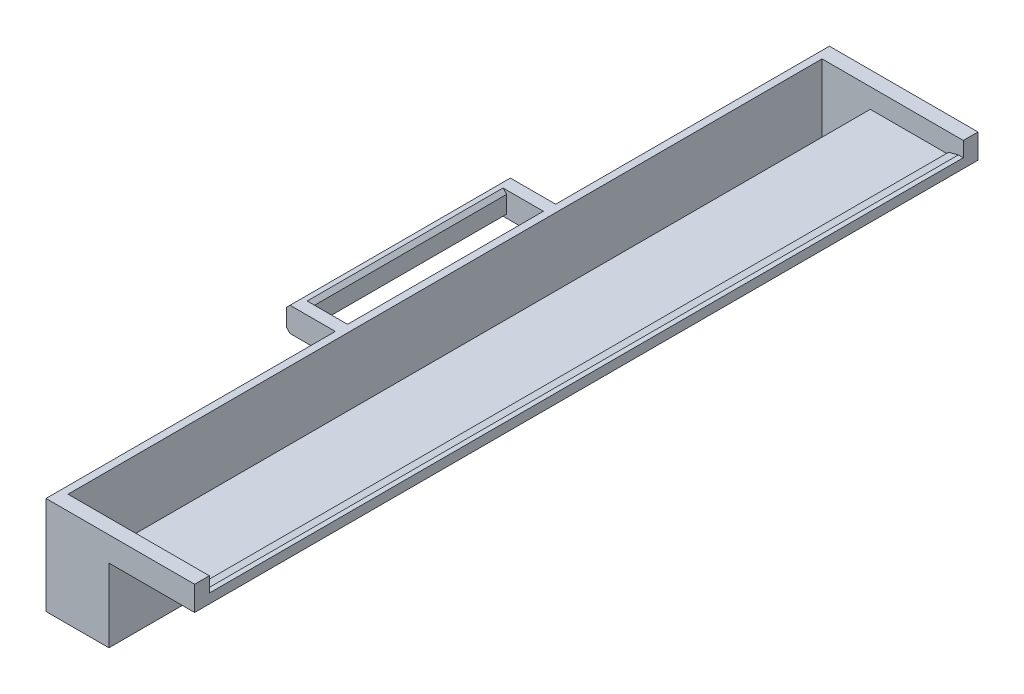
ISO-10303-21;
HEADER;
FILE_DESCRIPTION(('STEP AP214'),'2;1');
FILE_NAME('part.step','',(''),(''),'','','');
FILE_SCHEMA(('AUTOMOTIVE_DESIGN { 1 0 10303 214 1 1 1 1 }'));
ENDSEC;
DATA;
#1=APPLICATION_CONTEXT('core data for automotive mechanical design processes');
#2=APPLICATION_PROTOCOL_DEFINITION('international standard','automotive_design',2000,#1);
#3=PRODUCT_CONTEXT('',#1,'mechanical');
#4=PRODUCT('Part','Part','',(#3));
#5=PRODUCT_RELATED_PRODUCT_CATEGORY('part','',(#4));
#6=PRODUCT_DEFINITION_FORMATION('','',#4);
#7=PRODUCT_DEFINITION_CONTEXT('part definition',#1,'design');
#8=PRODUCT_DEFINITION('design','',#6,#7);
#9=PRODUCT_DEFINITION_SHAPE('','',#8);
#10=(LENGTH_UNIT() NAMED_UNIT(*) SI_UNIT(.MILLI.,.METRE.));
#11=(NAMED_UNIT(*) PLANE_ANGLE_UNIT() SI_UNIT($,.RADIAN.));
#12=(NAMED_UNIT(*) SI_UNIT($,.STERADIAN.) SOLID_ANGLE_UNIT());
#13=UNCERTAINTY_MEASURE_WITH_UNIT(LENGTH_MEASURE(1.E-05),#10,'distance_accuracy_value','');
#14=(GEOMETRIC_REPRESENTATION_CONTEXT(3) GLOBAL_UNCERTAINTY_ASSIGNED_CONTEXT((#13)) GLOBAL_UNIT_ASSIGNED_CONTEXT((#10,
#11,#12)) REPRESENTATION_CONTEXT('',''));
#15=CARTESIAN_POINT('',(0.,0.,0.));
#16=DIRECTION('',(0.,0.,1.));
#17=DIRECTION('',(1.,0.,0.));
#18=AXIS2_PLACEMENT_3D('',#15,#16,#17);
#19=CARTESIAN_POINT('',(-65.6625346479725,7.7724,406.4));
#20=DIRECTION('',(1.,0.,0.));
#21=DIRECTION('',(0.,0.,-1.));
#22=AXIS2_PLACEMENT_3D('',#19,#20,#21);
#23=PLANE('',#22);
#24=DIRECTION('',(0.,0.,-1.));
#25=VECTOR('',#24,1.);
#26=CARTESIAN_POINT('',(-65.6625346479725,-39.2176,406.4));
#27=LINE('',#26,#25);
#28=CARTESIAN_POINT('',(-65.6625346479725,-39.2176,398.78));
#29=VERTEX_POINT('',#28);
#30=CARTESIAN_POINT('',(-65.6625346479725,-39.2176,7.62000000000001));
#31=VERTEX_POINT('',#30);
#32=EDGE_CURVE('E371',#29,#31,#27,.T.);
#33=ORIENTED_EDGE('',*,*,#32,.T.);
#34=DIRECTION('',(0.,-1.,0.));
#35=VECTOR('',#34,1.);
#36=CARTESIAN_POINT('',(-65.6625346479725,7.7724,7.62000000000001));
#37=LINE('',#36,#35);
#38=CARTESIAN_POINT('',(-65.6625346479725,7.7724,7.62000000000001));
#39=VERTEX_POINT('',#38);
#40=EDGE_CURVE('E300',#39,#31,#37,.T.);
#41=ORIENTED_EDGE('',*,*,#40,.F.);
#42=DIRECTION('',(0.,0.,-1.));
#43=VECTOR('',#42,1.);
#44=CARTESIAN_POINT('',(-65.6625346479725,7.7724,406.4));
#45=LINE('',#44,#43);
#46=CARTESIAN_POINT('',(-65.6625346479725,7.7724,398.78));
#47=VERTEX_POINT('',#46);
#48=EDGE_CURVE('E374',#47,#39,#45,.T.);
#49=ORIENTED_EDGE('',*,*,#48,.F.);
#50=DIRECTION('',(0.,-1.,0.));
#51=VECTOR('',#50,1.);
#52=CARTESIAN_POINT('',(-65.6625346479725,7.7724,398.78));
#53=LINE('',#52,#51);
#54=EDGE_CURVE('E313',#47,#29,#53,.T.);
#55=ORIENTED_EDGE('',*,*,#54,.T.);
#56=EDGE_LOOP('',(#33,#41,#49,#55));
#57=FACE_BOUND('',#56,.T.);
#58=ADVANCED_FACE('F40',(#57),#23,.T.);
#59=CARTESIAN_POINT('',(-40.64,-39.2176,406.4));
#60=DIRECTION('',(-1.,0.,0.));
#61=DIRECTION('',(0.,0.,1.));
#62=AXIS2_PLACEMENT_3D('',#59,#60,#61);
#63=PLANE('',#62);
#64=DIRECTION('',(0.,-1.,0.));
#65=VECTOR('',#64,1.);
#66=CARTESIAN_POINT('',(-40.64,-39.2176,7.62000000000001));
#67=LINE('',#66,#65);
#68=CARTESIAN_POINT('',(-40.64,-2.3876,7.62000000000002));
#69=VERTEX_POINT('',#68);
#70=CARTESIAN_POINT('',(-40.64,-39.2176,7.62000000000001));
#71=VERTEX_POINT('',#70);
#72=EDGE_CURVE('E264',#69,#71,#67,.T.);
#73=ORIENTED_EDGE('',*,*,#72,.T.);
#74=DIRECTION('',(0.,0.,-1.));
#75=VECTOR('',#74,1.);
#76=CARTESIAN_POINT('',(-40.64,-39.2176,406.4));
#77=LINE('',#76,#75);
#78=CARTESIAN_POINT('',(-40.64,-39.2176,398.78));
#79=VERTEX_POINT('',#78);
#80=EDGE_CURVE('E368',#79,#71,#77,.T.);
#81=ORIENTED_EDGE('',*,*,#80,.F.);
#82=DIRECTION('',(0.,1.,0.));
#83=VECTOR('',#82,1.);
#84=CARTESIAN_POINT('',(-40.64,-39.2176,398.78));
#85=LINE('',#84,#83);
#86=CARTESIAN_POINT('',(-40.64,-2.3876,398.78));
#87=VERTEX_POINT('',#86);
#88=EDGE_CURVE('E288',#79,#87,#85,.T.);
#89=ORIENTED_EDGE('',*,*,#88,.T.);
#90=DIRECTION('',(0.,0.,-1.));
#91=VECTOR('',#90,1.);
#92=CARTESIAN_POINT('',(-40.64,-2.3876,406.4));
#93=LINE('',#92,#91);
#94=EDGE_CURVE('E365',#87,#69,#93,.T.);
#95=ORIENTED_EDGE('',*,*,#94,.T.);
#96=EDGE_LOOP('',(#73,#81,#89,#95));
#97=FACE_BOUND('',#96,.T.);
#98=ADVANCED_FACE('F433',(#97),#63,.T.);
#99=CARTESIAN_POINT('',(-65.6625346479725,-39.2176,406.4));
#100=DIRECTION('',(0.,1.,0.));
#101=DIRECTION('',(0.,0.,1.));
#102=AXIS2_PLACEMENT_3D('',#99,#100,#101);
#103=PLANE('',#102);
#104=DIRECTION('',(-1.,0.,0.));
#105=VECTOR('',#104,1.);
#106=CARTESIAN_POINT('',(-65.6625346479725,-39.2176,7.62000000000001));
#107=LINE('',#106,#105);
#108=EDGE_CURVE('E282',#71,#31,#107,.T.);
#109=ORIENTED_EDGE('',*,*,#108,.T.);
#110=ORIENTED_EDGE('',*,*,#32,.F.);
#111=DIRECTION('',(1.,0.,0.));
#112=VECTOR('',#111,1.);
#113=CARTESIAN_POINT('',(-65.6625346479725,-39.2176,398.78));
#114=LINE('',#113,#112);
#115=EDGE_CURVE('E285',#29,#79,#114,.T.);
#116=ORIENTED_EDGE('',*,*,#115,.T.);
#117=ORIENTED_EDGE('',*,*,#80,.T.);
#118=EDGE_LOOP('',(#109,#110,#116,#117));
#119=FACE_BOUND('',#118,.T.);
#120=ADVANCED_FACE('F441',(#119),#103,.T.);
#121=CARTESIAN_POINT('',(7.62,0.,406.4));
#122=DIRECTION('',(0.,-1.,0.));
#123=DIRECTION('',(1.,0.,0.));
#124=AXIS2_PLACEMENT_3D('',#121,#122,#123);
#125=PLANE('',#124);
#126=DIRECTION('',(1.,0.,0.));
#127=VECTOR('',#126,1.);
#128=CARTESIAN_POINT('',(7.61999999999994,0.,7.62000000000002));
#129=LINE('',#128,#127);
#130=CARTESIAN_POINT('',(5.07999999999997,0.,7.62000000000002));
#131=VERTEX_POINT('',#130);
#132=CARTESIAN_POINT('',(7.62,0.,7.62000000000002));
#133=VERTEX_POINT('',#132);
#134=EDGE_CURVE('E304',#131,#133,#129,.T.);
#135=ORIENTED_EDGE('',*,*,#134,.F.);
#136=DIRECTION('',(0.,0.,1.));
#137=VECTOR('',#136,1.);
#138=CARTESIAN_POINT('',(5.07999999999997,0.,406.4));
#139=LINE('',#138,#137);
#140=CARTESIAN_POINT('',(5.07999999999997,0.,398.78));
#141=VERTEX_POINT('',#140);
#142=EDGE_CURVE('E55',#131,#141,#139,.T.);
#143=ORIENTED_EDGE('',*,*,#142,.T.);
#144=DIRECTION('',(-1.,0.,0.));
#145=VECTOR('',#144,1.);
#146=CARTESIAN_POINT('',(7.62,0.,398.78));
#147=LINE('',#146,#145);
#148=CARTESIAN_POINT('',(7.62,0.,398.78));
#149=VERTEX_POINT('',#148);
#150=EDGE_CURVE('E322',#149,#141,#147,.T.);
#151=ORIENTED_EDGE('',*,*,#150,.F.);
#152=DIRECTION('',(0.,0.,-1.));
#153=VECTOR('',#152,1.);
#154=CARTESIAN_POINT('',(7.62,0.,406.4));
#155=LINE('',#154,#153);
#156=EDGE_CURVE('E359',#149,#133,#155,.T.);
#157=ORIENTED_EDGE('',*,*,#156,.T.);
#158=EDGE_LOOP('',(#135,#143,#151,#157));
#159=FACE_BOUND('',#158,.T.);
#160=ADVANCED_FACE('F453',(#159),#125,.F.);
#161=CARTESIAN_POINT('',(0.,0.,406.4));
#162=DIRECTION('',(1.,0.,0.));
#163=DIRECTION('',(0.,1.,0.));
#164=AXIS2_PLACEMENT_3D('',#161,#162,#163);
#165=PLANE('',#164);
#166=DIRECTION('',(0.,-1.,0.));
#167=VECTOR('',#166,1.);
#168=CARTESIAN_POINT('',(0.,0.,398.78));
#169=LINE('',#168,#167);
#170=CARTESIAN_POINT('',(0.,-1.36118189755008,398.78));
#171=VERTEX_POINT('',#170);
#172=CARTESIAN_POINT('',(0.,-2.3876,398.78));
#173=VERTEX_POINT('',#172);
#174=EDGE_CURVE('E320',#171,#173,#169,.T.);
#175=ORIENTED_EDGE('',*,*,#174,.F.);
#176=DIRECTION('',(0.,0.,-1.));
#177=VECTOR('',#176,1.);
#178=CARTESIAN_POINT('',(0.,-1.36118189755008,406.4));
#179=LINE('',#178,#177);
#180=CARTESIAN_POINT('',(0.,-1.36118189755008,7.62000000000002));
#181=VERTEX_POINT('',#180);
#182=EDGE_CURVE('E416',#171,#181,#179,.T.);
#183=ORIENTED_EDGE('',*,*,#182,.T.);
#184=DIRECTION('',(0.,1.,0.));
#185=VECTOR('',#184,1.);
#186=CARTESIAN_POINT('',(0.,0.,7.62000000000002));
#187=LINE('',#186,#185);
#188=CARTESIAN_POINT('',(0.,-2.3876,7.62000000000002));
#189=VERTEX_POINT('',#188);
#190=EDGE_CURVE('E302',#189,#181,#187,.T.);
#191=ORIENTED_EDGE('',*,*,#190,.F.);
#192=DIRECTION('',(0.,0.,-1.));
#193=VECTOR('',#192,1.);
#194=CARTESIAN_POINT('',(0.,-2.3876,406.4));
#195=LINE('',#194,#193);
#196=EDGE_CURVE('E362',#173,#189,#195,.T.);
#197=ORIENTED_EDGE('',*,*,#196,.F.);
#198=EDGE_LOOP('',(#175,#183,#191,#197));
#199=FACE_BOUND('',#198,.T.);
#200=ADVANCED_FACE('F422',(#199),#165,.F.);
#201=CARTESIAN_POINT('',(0.,-2.3876,406.4));
#202=DIRECTION('',(0.,-1.,0.));
#203=DIRECTION('',(1.,0.,0.));
#204=AXIS2_PLACEMENT_3D('',#201,#202,#203);
#205=PLANE('',#204);
#206=DIRECTION('',(1.,0.,0.));
#207=VECTOR('',#206,1.);
#208=CARTESIAN_POINT('',(7.62,-2.3876,7.62));
#209=LINE('',#208,#207);
#210=EDGE_CURVE('E290',#69,#189,#209,.T.);
#211=ORIENTED_EDGE('',*,*,#210,.F.);
#212=ORIENTED_EDGE('',*,*,#94,.F.);
#213=DIRECTION('',(-1.,0.,0.));
#214=VECTOR('',#213,1.);
#215=CARTESIAN_POINT('',(7.62,-2.3876,398.78));
#216=LINE('',#215,#214);
#217=EDGE_CURVE('E306',#173,#87,#216,.T.);
#218=ORIENTED_EDGE('',*,*,#217,.F.);
#219=ORIENTED_EDGE('',*,*,#196,.T.);
#220=EDGE_LOOP('',(#211,#212,#218,#219));
#221=FACE_BOUND('',#220,.T.);
#222=ADVANCED_FACE('F430',(#221),#205,.F.);
#223=CARTESIAN_POINT('',(-36.83,-4.9276,406.4));
#224=DIRECTION('',(1.,0.,0.));
#225=DIRECTION('',(0.,1.,0.));
#226=AXIS2_PLACEMENT_3D('',#223,#224,#225);
#227=PLANE('',#226);
#228=DIRECTION('',(0.,-1.,0.));
#229=VECTOR('',#228,1.);
#230=CARTESIAN_POINT('',(-36.83,-4.9276,0.));
#231=LINE('',#230,#229);
#232=CARTESIAN_POINT('',(-36.83,-4.9276,0.));
#233=VERTEX_POINT('',#232);
#234=CARTESIAN_POINT('',(-36.83,-43.0276,0.));
#235=VERTEX_POINT('',#234);
#236=EDGE_CURVE('E324',#233,#235,#231,.T.);
#237=ORIENTED_EDGE('',*,*,#236,.F.);
#238=DIRECTION('',(0.,0.,-1.));
#239=VECTOR('',#238,1.);
#240=CARTESIAN_POINT('',(-36.83,-4.9276,406.4));
#241=LINE('',#240,#239);
#242=CARTESIAN_POINT('',(-36.83,-4.9276,406.4));
#243=VERTEX_POINT('',#242);
#244=EDGE_CURVE('E353',#243,#233,#241,.T.);
#245=ORIENTED_EDGE('',*,*,#244,.F.);
#246=DIRECTION('',(0.,-1.,0.));
#247=VECTOR('',#246,1.);
#248=CARTESIAN_POINT('',(-36.83,-4.9276,406.4));
#249=LINE('',#248,#247);
#250=CARTESIAN_POINT('',(-36.83,-43.0276,406.4));
#251=VERTEX_POINT('',#250);
#252=EDGE_CURVE('E325',#243,#251,#249,.T.);
#253=ORIENTED_EDGE('',*,*,#252,.T.);
#254=DIRECTION('',(0.,0.,-1.));
#255=VECTOR('',#254,1.);
#256=CARTESIAN_POINT('',(-36.83,-43.0276,406.4));
#257=LINE('',#256,#255);
#258=EDGE_CURVE('E341',#251,#235,#257,.T.);
#259=ORIENTED_EDGE('',*,*,#258,.T.);
#260=EDGE_LOOP('',(#237,#245,#253,#259));
#261=FACE_BOUND('',#260,.T.);
#262=ADVANCED_FACE('F478',(#261),#227,.T.);
#263=CARTESIAN_POINT('',(-36.83,-4.9276,406.4));
#264=DIRECTION('',(0.,1.,0.));
#265=DIRECTION('',(0.,0.,1.));
#266=AXIS2_PLACEMENT_3D('',#263,#264,#265);
#267=PLANE('',#266);
#268=DIRECTION('',(1.,0.,0.));
#269=VECTOR('',#268,1.);
#270=CARTESIAN_POINT('',(-36.83,-4.9276,0.));
#271=LINE('',#270,#269);
#272=CARTESIAN_POINT('',(7.62,-4.9276,0.));
#273=VERTEX_POINT('',#272);
#274=EDGE_CURVE('E329',#233,#273,#271,.T.);
#275=ORIENTED_EDGE('',*,*,#274,.T.);
#276=DIRECTION('',(0.,0.,-1.));
#277=VECTOR('',#276,1.);
#278=CARTESIAN_POINT('',(7.62,-4.9276,406.4));
#279=LINE('',#278,#277);
#280=CARTESIAN_POINT('',(7.62,-4.9276,406.4));
#281=VERTEX_POINT('',#280);
#282=EDGE_CURVE('E356',#281,#273,#279,.T.);
#283=ORIENTED_EDGE('',*,*,#282,.F.);
#284=DIRECTION('',(1.,0.,0.));
#285=VECTOR('',#284,1.);
#286=CARTESIAN_POINT('',(-36.83,-4.9276,406.4));
#287=LINE('',#286,#285);
#288=EDGE_CURVE('E339',#243,#281,#287,.T.);
#289=ORIENTED_EDGE('',*,*,#288,.F.);
#290=ORIENTED_EDGE('',*,*,#244,.T.);
#291=EDGE_LOOP('',(#275,#283,#289,#290));
#292=FACE_BOUND('',#291,.T.);
#293=ADVANCED_FACE('F481',(#292),#267,.F.);
#294=CARTESIAN_POINT('',(7.62,-4.9276,406.4));
#295=DIRECTION('',(-1.,0.,0.));
#296=DIRECTION('',(0.,0.,1.));
#297=AXIS2_PLACEMENT_3D('',#294,#295,#296);
#298=PLANE('',#297);
#299=DIRECTION('',(0.,1.,0.));
#300=VECTOR('',#299,1.);
#301=CARTESIAN_POINT('',(7.62,-4.9276,0.));
#302=LINE('',#301,#300);
#303=CARTESIAN_POINT('',(7.62,7.77240000000001,0.));
#304=VERTEX_POINT('',#303);
#305=EDGE_CURVE('E350',#273,#304,#302,.T.);
#306=ORIENTED_EDGE('',*,*,#305,.T.);
#307=DIRECTION('',(0.,0.,-1.));
#308=VECTOR('',#307,1.);
#309=CARTESIAN_POINT('',(7.62,7.77240000000001,0.));
#310=LINE('',#309,#308);
#311=CARTESIAN_POINT('',(7.62,7.77240000000001,7.62));
#312=VERTEX_POINT('',#311);
#313=EDGE_CURVE('E291',#312,#304,#310,.T.);
#314=ORIENTED_EDGE('',*,*,#313,.F.);
#315=DIRECTION('',(0.,-1.,0.));
#316=VECTOR('',#315,1.);
#317=CARTESIAN_POINT('',(7.62,7.77240000000001,7.62));
#318=LINE('',#317,#316);
#319=EDGE_CURVE('E295',#312,#133,#318,.T.);
#320=ORIENTED_EDGE('',*,*,#319,.T.);
#321=ORIENTED_EDGE('',*,*,#156,.F.);
#322=DIRECTION('',(0.,-1.,0.));
#323=VECTOR('',#322,1.);
#324=CARTESIAN_POINT('',(7.62,7.77240000000001,398.78));
#325=LINE('',#324,#323);
#326=CARTESIAN_POINT('',(7.62,7.77240000000001,398.78));
#327=VERTEX_POINT('',#326);
#328=EDGE_CURVE('E317',#327,#149,#325,.T.);
#329=ORIENTED_EDGE('',*,*,#328,.F.);
#330=DIRECTION('',(0.,0.,-1.));
#331=VECTOR('',#330,1.);
#332=CARTESIAN_POINT('',(7.62,7.77240000000001,406.4));
#333=LINE('',#332,#331);
#334=CARTESIAN_POINT('',(7.62,7.77240000000001,406.4));
#335=VERTEX_POINT('',#334);
#336=EDGE_CURVE('E307',#335,#327,#333,.T.);
#337=ORIENTED_EDGE('',*,*,#336,.F.);
#338=DIRECTION('',(0.,1.,0.));
#339=VECTOR('',#338,1.);
#340=CARTESIAN_POINT('',(7.62,-4.9276,406.4));
#341=LINE('',#340,#339);
#342=EDGE_CURVE('E337',#281,#335,#341,.T.);
#343=ORIENTED_EDGE('',*,*,#342,.F.);
#344=ORIENTED_EDGE('',*,*,#282,.T.);
#345=EDGE_LOOP('',(#306,#314,#320,#321,#329,#337,#343,#344));
#346=FACE_BOUND('',#345,.T.);
#347=ADVANCED_FACE('F450',(#346),#298,.F.);
#348=CARTESIAN_POINT('',(-69.4725346479725,7.7724,406.4));
#349=DIRECTION('',(0.,1.,0.));
#350=DIRECTION('',(0.,0.,1.));
#351=AXIS2_PLACEMENT_3D('',#348,#349,#350);
#352=PLANE('',#351);
#353=DIRECTION('',(0.,0.,-1.));
#354=VECTOR('',#353,1.);
#355=CARTESIAN_POINT('',(-90.4275346479724,7.7724,406.4));
#356=LINE('',#355,#354);
#357=CARTESIAN_POINT('',(-90.4275346479725,7.7724,249.958132937121));
#358=VERTEX_POINT('',#357);
#359=CARTESIAN_POINT('',(-90.4275346479725,7.7724,148.358132937121));
#360=VERTEX_POINT('',#359);
#361=EDGE_CURVE('E401',#358,#360,#356,.T.);
#362=ORIENTED_EDGE('',*,*,#361,.T.);
#363=DIRECTION('',(1.,0.,0.));
#364=VECTOR('',#363,1.);
#365=CARTESIAN_POINT('',(-69.4725346479725,7.7724,148.358132937121));
#366=LINE('',#365,#364);
#367=CARTESIAN_POINT('',(-69.4725346479725,7.7724,148.358132937121));
#368=VERTEX_POINT('',#367);
#369=EDGE_CURVE('E258',#360,#368,#366,.T.);
#370=ORIENTED_EDGE('',*,*,#369,.T.);
#371=DIRECTION('',(0.,0.,-1.));
#372=VECTOR('',#371,1.);
#373=CARTESIAN_POINT('',(-69.4725346479725,7.7724,406.4));
#374=LINE('',#373,#372);
#375=CARTESIAN_POINT('',(-69.4725346479725,7.7724,249.958132937121));
#376=VERTEX_POINT('',#375);
#377=EDGE_CURVE('E230',#376,#368,#374,.T.);
#378=ORIENTED_EDGE('',*,*,#377,.F.);
#379=DIRECTION('',(-1.,0.,0.));
#380=VECTOR('',#379,1.);
#381=CARTESIAN_POINT('',(-88.5225346479724,7.7724,249.958132937121));
#382=LINE('',#381,#380);
#383=EDGE_CURVE('E252',#376,#358,#382,.T.);
#384=ORIENTED_EDGE('',*,*,#383,.T.);
#385=EDGE_LOOP('',(#362,#370,#378,#384));
#386=FACE_BOUND('',#385,.T.);
#387=DIRECTION('',(-1.,0.,0.));
#388=VECTOR('',#387,1.);
#389=CARTESIAN_POINT('',(-69.4725346479725,7.7724,142.008132937121));
#390=LINE('',#389,#388);
#391=CARTESIAN_POINT('',(-69.4725346479725,7.7724,142.008132937121));
#392=VERTEX_POINT('',#391);
#393=CARTESIAN_POINT('',(-92.9675346479725,7.7724,142.008132937121));
#394=VERTEX_POINT('',#393);
#395=EDGE_CURVE('E222',#392,#394,#390,.T.);
#396=ORIENTED_EDGE('',*,*,#395,.T.);
#397=DIRECTION('',(0.,0.,1.));
#398=VECTOR('',#397,1.);
#399=CARTESIAN_POINT('',(-92.9675346479724,7.7724,406.4));
#400=LINE('',#399,#398);
#401=CARTESIAN_POINT('',(-92.9675346479725,7.7724,256.30813293712));
#402=VERTEX_POINT('',#401);
#403=EDGE_CURVE('E404',#394,#402,#400,.T.);
#404=ORIENTED_EDGE('',*,*,#403,.T.);
#405=DIRECTION('',(1.,0.,0.));
#406=VECTOR('',#405,1.);
#407=CARTESIAN_POINT('',(-69.4725346479725,7.7724,256.30813293712));
#408=LINE('',#407,#406);
#409=CARTESIAN_POINT('',(-69.4725346479725,7.7724,256.30813293712));
#410=VERTEX_POINT('',#409);
#411=EDGE_CURVE('E250',#402,#410,#408,.T.);
#412=ORIENTED_EDGE('',*,*,#411,.T.);
#413=CARTESIAN_POINT('',(-69.4725346479725,7.7724,406.4));
#414=VERTEX_POINT('',#413);
#415=EDGE_CURVE('E233',#414,#410,#374,.T.);
#416=ORIENTED_EDGE('',*,*,#415,.F.);
#417=DIRECTION('',(1.,0.,0.));
#418=VECTOR('',#417,1.);
#419=CARTESIAN_POINT('',(-69.4725346479725,7.7724,406.4));
#420=LINE('',#419,#418);
#421=EDGE_CURVE('E334',#414,#335,#420,.T.);
#422=ORIENTED_EDGE('',*,*,#421,.T.);
#423=ORIENTED_EDGE('',*,*,#336,.T.);
#424=DIRECTION('',(-1.,0.,0.));
#425=VECTOR('',#424,1.);
#426=CARTESIAN_POINT('',(7.62,7.77240000000001,398.78));
#427=LINE('',#426,#425);
#428=EDGE_CURVE('E310',#327,#47,#427,.T.);
#429=ORIENTED_EDGE('',*,*,#428,.T.);
#430=ORIENTED_EDGE('',*,*,#48,.T.);
#431=DIRECTION('',(1.,0.,0.));
#432=VECTOR('',#431,1.);
#433=CARTESIAN_POINT('',(7.62,7.77240000000001,7.62));
#434=LINE('',#433,#432);
#435=EDGE_CURVE('E293',#39,#312,#434,.T.);
#436=ORIENTED_EDGE('',*,*,#435,.T.);
#437=ORIENTED_EDGE('',*,*,#313,.T.);
#438=DIRECTION('',(1.,0.,0.));
#439=VECTOR('',#438,1.);
#440=CARTESIAN_POINT('',(-69.4725346479725,7.7724,0.));
#441=LINE('',#440,#439);
#442=CARTESIAN_POINT('',(-69.4725346479725,7.7724,0.));
#443=VERTEX_POINT('',#442);
#444=EDGE_CURVE('E226',#443,#304,#441,.T.);
#445=ORIENTED_EDGE('',*,*,#444,.F.);
#446=EDGE_CURVE('E217',#392,#443,#374,.T.);
#447=ORIENTED_EDGE('',*,*,#446,.F.);
#448=EDGE_LOOP('',(#396,#404,#412,#416,#422,#423,#429,#430,#436,#437,#445,#447));
#449=FACE_BOUND('',#448,.T.);
#450=ADVANCED_FACE('F219',(#386,#449),#352,.T.);
#451=CARTESIAN_POINT('',(-69.4725346479725,-43.0276,406.4));
#452=DIRECTION('',(-1.,0.,0.));
#453=DIRECTION('',(0.,0.,1.));
#454=AXIS2_PLACEMENT_3D('',#451,#452,#453);
#455=PLANE('',#454);
#456=DIRECTION('',(0.,1.,0.));
#457=VECTOR('',#456,1.);
#458=CARTESIAN_POINT('',(-69.4725346479725,-4.9276,249.958132937121));
#459=LINE('',#458,#457);
#460=CARTESIAN_POINT('',(-69.4725346479725,-4.9276,249.958132937121));
#461=VERTEX_POINT('',#460);
#462=EDGE_CURVE('E271',#461,#376,#459,.T.);
#463=ORIENTED_EDGE('',*,*,#462,.T.);
#464=ORIENTED_EDGE('',*,*,#377,.T.);
#465=DIRECTION('',(0.,1.,0.));
#466=VECTOR('',#465,1.);
#467=CARTESIAN_POINT('',(-69.4725346479725,-4.9276,148.358132937121));
#468=LINE('',#467,#466);
#469=CARTESIAN_POINT('',(-69.4725346479725,-4.9276,148.358132937121));
#470=VERTEX_POINT('',#469);
#471=EDGE_CURVE('E261',#470,#368,#468,.T.);
#472=ORIENTED_EDGE('',*,*,#471,.F.);
#473=DIRECTION('',(0.,0.,-1.));
#474=VECTOR('',#473,1.);
#475=CARTESIAN_POINT('',(-69.4725346479725,-4.9276,148.358132937121));
#476=LINE('',#475,#474);
#477=CARTESIAN_POINT('',(-69.4725346479725,-4.9276,142.008132937121));
#478=VERTEX_POINT('',#477);
#479=EDGE_CURVE('E239',#470,#478,#476,.T.);
#480=ORIENTED_EDGE('',*,*,#479,.T.);
#481=DIRECTION('',(0.,1.,0.));
#482=VECTOR('',#481,1.);
#483=CARTESIAN_POINT('',(-69.4725346479725,-4.9276,142.008132937121));
#484=LINE('',#483,#482);
#485=EDGE_CURVE('E235',#478,#392,#484,.T.);
#486=ORIENTED_EDGE('',*,*,#485,.T.);
#487=ORIENTED_EDGE('',*,*,#446,.T.);
#488=DIRECTION('',(0.,1.,0.));
#489=VECTOR('',#488,1.);
#490=CARTESIAN_POINT('',(-69.4725346479725,-43.0276,0.));
#491=LINE('',#490,#489);
#492=CARTESIAN_POINT('',(-69.4725346479725,-43.0276,0.));
#493=VERTEX_POINT('',#492);
#494=EDGE_CURVE('E347',#493,#443,#491,.T.);
#495=ORIENTED_EDGE('',*,*,#494,.F.);
#496=DIRECTION('',(0.,0.,-1.));
#497=VECTOR('',#496,1.);
#498=CARTESIAN_POINT('',(-69.4725346479725,-43.0276,406.4));
#499=LINE('',#498,#497);
#500=CARTESIAN_POINT('',(-69.4725346479725,-43.0276,406.4));
#501=VERTEX_POINT('',#500);
#502=EDGE_CURVE('E231',#501,#493,#499,.T.);
#503=ORIENTED_EDGE('',*,*,#502,.F.);
#504=DIRECTION('',(0.,1.,0.));
#505=VECTOR('',#504,1.);
#506=CARTESIAN_POINT('',(-69.4725346479725,-43.0276,406.4));
#507=LINE('',#506,#505);
#508=EDGE_CURVE('E331',#501,#414,#507,.T.);
#509=ORIENTED_EDGE('',*,*,#508,.T.);
#510=ORIENTED_EDGE('',*,*,#415,.T.);
#511=DIRECTION('',(0.,1.,0.));
#512=VECTOR('',#511,1.);
#513=CARTESIAN_POINT('',(-69.4725346479725,-4.9276,256.30813293712));
#514=LINE('',#513,#512);
#515=CARTESIAN_POINT('',(-69.4725346479725,-4.9276,256.30813293712));
#516=VERTEX_POINT('',#515);
#517=EDGE_CURVE('E273',#516,#410,#514,.T.);
#518=ORIENTED_EDGE('',*,*,#517,.F.);
#519=DIRECTION('',(0.,0.,-1.));
#520=VECTOR('',#519,1.);
#521=CARTESIAN_POINT('',(-69.4725346479725,-4.9276,256.30813293712));
#522=LINE('',#521,#520);
#523=EDGE_CURVE('E505',#516,#461,#522,.T.);
#524=ORIENTED_EDGE('',*,*,#523,.T.);
#525=EDGE_LOOP('',(#463,#464,#472,#480,#486,#487,#495,#503,#509,#510,#518,#524));
#526=FACE_BOUND('',#525,.T.);
#527=ADVANCED_FACE('F237',(#526),#455,.T.);
#528=CARTESIAN_POINT('',(-69.4725346479725,-43.0276,406.4));
#529=DIRECTION('',(0.,1.,0.));
#530=DIRECTION('',(0.,0.,1.));
#531=AXIS2_PLACEMENT_3D('',#528,#529,#530);
#532=PLANE('',#531);
#533=DIRECTION('',(1.,0.,0.));
#534=VECTOR('',#533,1.);
#535=CARTESIAN_POINT('',(-69.4725346479725,-43.0276,0.));
#536=LINE('',#535,#534);
#537=EDGE_CURVE('E344',#493,#235,#536,.T.);
#538=ORIENTED_EDGE('',*,*,#537,.T.);
#539=ORIENTED_EDGE('',*,*,#258,.F.);
#540=DIRECTION('',(1.,0.,0.));
#541=VECTOR('',#540,1.);
#542=CARTESIAN_POINT('',(-69.4725346479725,-43.0276,406.4));
#543=LINE('',#542,#541);
#544=EDGE_CURVE('E328',#501,#251,#543,.T.);
#545=ORIENTED_EDGE('',*,*,#544,.F.);
#546=ORIENTED_EDGE('',*,*,#502,.T.);
#547=EDGE_LOOP('',(#538,#539,#545,#546));
#548=FACE_BOUND('',#547,.T.);
#549=ADVANCED_FACE('F473',(#548),#532,.F.);
#550=CARTESIAN_POINT('',(0.,0.,406.4));
#551=DIRECTION('',(0.,0.,1.));
#552=DIRECTION('',(1.,0.,0.));
#553=AXIS2_PLACEMENT_3D('',#550,#551,#552);
#554=PLANE('',#553);
#555=ORIENTED_EDGE('',*,*,#342,.T.);
#556=ORIENTED_EDGE('',*,*,#421,.F.);
#557=ORIENTED_EDGE('',*,*,#508,.F.);
#558=ORIENTED_EDGE('',*,*,#544,.T.);
#559=ORIENTED_EDGE('',*,*,#252,.F.);
#560=ORIENTED_EDGE('',*,*,#288,.T.);
#561=EDGE_LOOP('',(#555,#556,#557,#558,#559,#560));
#562=FACE_BOUND('',#561,.T.);
#563=ADVANCED_FACE('F476',(#562),#554,.T.);
#564=CARTESIAN_POINT('',(0.,0.,0.));
#565=DIRECTION('',(0.,0.,1.));
#566=DIRECTION('',(1.,0.,0.));
#567=AXIS2_PLACEMENT_3D('',#564,#565,#566);
#568=PLANE('',#567);
#569=ORIENTED_EDGE('',*,*,#444,.T.);
#570=ORIENTED_EDGE('',*,*,#305,.F.);
#571=ORIENTED_EDGE('',*,*,#274,.F.);
#572=ORIENTED_EDGE('',*,*,#236,.T.);
#573=ORIENTED_EDGE('',*,*,#537,.F.);
#574=ORIENTED_EDGE('',*,*,#494,.T.);
#575=EDGE_LOOP('',(#569,#570,#571,#572,#573,#574));
#576=FACE_BOUND('',#575,.T.);
#577=ADVANCED_FACE('F537',(#576),#568,.F.);
#578=CARTESIAN_POINT('',(7.62,7.77240000000001,398.78));
#579=DIRECTION('',(0.,0.,1.));
#580=DIRECTION('',(1.,0.,0.));
#581=AXIS2_PLACEMENT_3D('',#578,#579,#580);
#582=PLANE('',#581);
#583=ORIENTED_EDGE('',*,*,#328,.T.);
#584=ORIENTED_EDGE('',*,*,#150,.T.);
#585=DIRECTION('',(0.965925826289069,0.258819045102518,0.));
#586=VECTOR('',#585,1.);
#587=CARTESIAN_POINT('',(9.39295226280622,1.1556520758129,398.78));
#588=LINE('',#587,#586);
#589=EDGE_CURVE('E11',#141,#171,#588,.F.);
#590=ORIENTED_EDGE('',*,*,#589,.T.);
#591=ORIENTED_EDGE('',*,*,#174,.T.);
#592=ORIENTED_EDGE('',*,*,#217,.T.);
#593=ORIENTED_EDGE('',*,*,#88,.F.);
#594=ORIENTED_EDGE('',*,*,#115,.F.);
#595=ORIENTED_EDGE('',*,*,#54,.F.);
#596=ORIENTED_EDGE('',*,*,#428,.F.);
#597=EDGE_LOOP('',(#583,#584,#590,#591,#592,#593,#594,#595,#596));
#598=FACE_BOUND('',#597,.T.);
#599=ADVANCED_FACE('F437',(#598),#582,.F.);
#600=CARTESIAN_POINT('',(7.62,7.77240000000001,7.62));
#601=DIRECTION('',(0.,0.,-1.));
#602=DIRECTION('',(-1.,0.,0.));
#603=AXIS2_PLACEMENT_3D('',#600,#601,#602);
#604=PLANE('',#603);
#605=ORIENTED_EDGE('',*,*,#190,.T.);
#606=DIRECTION('',(-0.965925826289069,-0.258819045102518,0.));
#607=VECTOR('',#606,1.);
#608=CARTESIAN_POINT('',(9.39295226280622,1.1556520758129,7.62));
#609=LINE('',#608,#607);
#610=EDGE_CURVE('E48',#181,#131,#609,.F.);
#611=ORIENTED_EDGE('',*,*,#610,.T.);
#612=ORIENTED_EDGE('',*,*,#134,.T.);
#613=ORIENTED_EDGE('',*,*,#319,.F.);
#614=ORIENTED_EDGE('',*,*,#435,.F.);
#615=ORIENTED_EDGE('',*,*,#40,.T.);
#616=ORIENTED_EDGE('',*,*,#108,.F.);
#617=ORIENTED_EDGE('',*,*,#72,.F.);
#618=ORIENTED_EDGE('',*,*,#210,.T.);
#619=EDGE_LOOP('',(#605,#611,#612,#613,#614,#615,#616,#617,#618));
#620=FACE_BOUND('',#619,.T.);
#621=ADVANCED_FACE('F426',(#620),#604,.F.);
#622=CARTESIAN_POINT('',(-69.4725346479725,-4.9276,148.358132937121));
#623=DIRECTION('',(0.,0.,1.));
#624=DIRECTION('',(1.,0.,0.));
#625=AXIS2_PLACEMENT_3D('',#622,#623,#624);
#626=PLANE('',#625);
#627=ORIENTED_EDGE('',*,*,#369,.F.);
#628=DIRECTION('',(-0.707106781186549,0.707106781186546,0.));
#629=VECTOR('',#628,1.);
#630=CARTESIAN_POINT('',(-90.4275346479725,7.77239999999998,148.358132937121));
#631=LINE('',#630,#629);
#632=CARTESIAN_POINT('',(-88.5225346479725,5.86740000000001,148.358132937121));
#633=VERTEX_POINT('',#632);
#634=EDGE_CURVE('E411',#360,#633,#631,.F.);
#635=ORIENTED_EDGE('',*,*,#634,.T.);
#636=DIRECTION('',(0.,1.,0.));
#637=VECTOR('',#636,1.);
#638=CARTESIAN_POINT('',(-88.5225346479725,-4.9276,148.358132937121));
#639=LINE('',#638,#637);
#640=CARTESIAN_POINT('',(-88.5225346479725,-3.0225999999999,148.358132937121));
#641=VERTEX_POINT('',#640);
#642=EDGE_CURVE('E265',#641,#633,#639,.T.);
#643=ORIENTED_EDGE('',*,*,#642,.F.);
#644=DIRECTION('',(-0.707106781186536,-0.707106781186559,0.));
#645=VECTOR('',#644,1.);
#646=CARTESIAN_POINT('',(-88.5225346479725,-3.0225999999999,148.358132937121));
#647=LINE('',#646,#645);
#648=CARTESIAN_POINT('',(-90.4275346479725,-4.9276,148.358132937121));
#649=VERTEX_POINT('',#648);
#650=EDGE_CURVE('E406',#641,#649,#647,.T.);
#651=ORIENTED_EDGE('',*,*,#650,.T.);
#652=DIRECTION('',(1.,0.,0.));
#653=VECTOR('',#652,1.);
#654=CARTESIAN_POINT('',(-69.4725346479725,-4.9276,148.358132937121));
#655=LINE('',#654,#653);
#656=EDGE_CURVE('E244',#649,#470,#655,.T.);
#657=ORIENTED_EDGE('',*,*,#656,.T.);
#658=ORIENTED_EDGE('',*,*,#471,.T.);
#659=EDGE_LOOP('',(#627,#635,#643,#651,#657,#658));
#660=FACE_BOUND('',#659,.T.);
#661=ADVANCED_FACE('F534',(#660),#626,.T.);
#662=CARTESIAN_POINT('',(-88.5225346479725,-4.9276,148.358132937121));
#663=DIRECTION('',(1.,0.,0.));
#664=DIRECTION('',(0.,0.,-1.));
#665=AXIS2_PLACEMENT_3D('',#662,#663,#664);
#666=PLANE('',#665);
#667=DIRECTION('',(0.,1.,0.));
#668=VECTOR('',#667,1.);
#669=CARTESIAN_POINT('',(-88.5225346479724,-4.9276,249.958132937121));
#670=LINE('',#669,#668);
#671=CARTESIAN_POINT('',(-88.5225346479724,-3.0225999999999,249.958132937121));
#672=VERTEX_POINT('',#671);
#673=CARTESIAN_POINT('',(-88.5225346479724,5.86740000000001,249.958132937121));
#674=VERTEX_POINT('',#673);
#675=EDGE_CURVE('E268',#672,#674,#670,.T.);
#676=ORIENTED_EDGE('',*,*,#675,.F.);
#677=DIRECTION('',(0.,0.,-1.));
#678=VECTOR('',#677,1.);
#679=CARTESIAN_POINT('',(-88.5225346479725,-3.0225999999999,148.358132937121));
#680=LINE('',#679,#678);
#681=EDGE_CURVE('E381',#672,#641,#680,.T.);
#682=ORIENTED_EDGE('',*,*,#681,.T.);
#683=ORIENTED_EDGE('',*,*,#642,.T.);
#684=DIRECTION('',(0.,0.,1.));
#685=VECTOR('',#684,1.);
#686=CARTESIAN_POINT('',(-88.5225346479725,5.86740000000001,148.358132937121));
#687=LINE('',#686,#685);
#688=EDGE_CURVE('E355',#633,#674,#687,.T.);
#689=ORIENTED_EDGE('',*,*,#688,.T.);
#690=EDGE_LOOP('',(#676,#682,#683,#689));
#691=FACE_BOUND('',#690,.T.);
#692=ADVANCED_FACE('F606',(#691),#666,.T.);
#693=CARTESIAN_POINT('',(-88.5225346479724,-4.9276,249.958132937121));
#694=DIRECTION('',(0.,0.,-1.));
#695=DIRECTION('',(-1.,0.,0.));
#696=AXIS2_PLACEMENT_3D('',#693,#694,#695);
#697=PLANE('',#696);
#698=ORIENTED_EDGE('',*,*,#383,.F.);
#699=ORIENTED_EDGE('',*,*,#462,.F.);
#700=DIRECTION('',(-1.,0.,0.));
#701=VECTOR('',#700,1.);
#702=CARTESIAN_POINT('',(-88.5225346479724,-4.9276,249.958132937121));
#703=LINE('',#702,#701);
#704=CARTESIAN_POINT('',(-90.4275346479725,-4.9276,249.958132937121));
#705=VERTEX_POINT('',#704);
#706=EDGE_CURVE('E510',#461,#705,#703,.T.);
#707=ORIENTED_EDGE('',*,*,#706,.T.);
#708=DIRECTION('',(0.707106781186536,0.707106781186559,0.));
#709=VECTOR('',#708,1.);
#710=CARTESIAN_POINT('',(-88.5225346479724,-3.02259999999991,249.958132937121));
#711=LINE('',#710,#709);
#712=EDGE_CURVE('E409',#705,#672,#711,.T.);
#713=ORIENTED_EDGE('',*,*,#712,.T.);
#714=ORIENTED_EDGE('',*,*,#675,.T.);
#715=DIRECTION('',(0.707106781186549,-0.707106781186546,0.));
#716=VECTOR('',#715,1.);
#717=CARTESIAN_POINT('',(-90.4275346479725,7.77239999999999,249.958132937121));
#718=LINE('',#717,#716);
#719=EDGE_CURVE('E413',#674,#358,#718,.F.);
#720=ORIENTED_EDGE('',*,*,#719,.T.);
#721=EDGE_LOOP('',(#698,#699,#707,#713,#714,#720));
#722=FACE_BOUND('',#721,.T.);
#723=ADVANCED_FACE('F528',(#722),#697,.T.);
#724=CARTESIAN_POINT('',(-69.4725346479725,-4.9276,256.30813293712));
#725=DIRECTION('',(0.,0.,1.));
#726=DIRECTION('',(1.,0.,0.));
#727=AXIS2_PLACEMENT_3D('',#724,#725,#726);
#728=PLANE('',#727);
#729=DIRECTION('',(0.,1.,0.));
#730=VECTOR('',#729,1.);
#731=CARTESIAN_POINT('',(-94.8725346479725,-4.9276,256.30813293712));
#732=LINE('',#731,#730);
#733=CARTESIAN_POINT('',(-94.8725346479725,-3.02259999999996,256.30813293712));
#734=VERTEX_POINT('',#733);
#735=CARTESIAN_POINT('',(-94.8725346479725,5.86740000000001,256.30813293712));
#736=VERTEX_POINT('',#735);
#737=EDGE_CURVE('E276',#734,#736,#732,.T.);
#738=ORIENTED_EDGE('',*,*,#737,.F.);
#739=DIRECTION('',(0.70710678118654,-0.707106781186555,0.));
#740=VECTOR('',#739,1.);
#741=CARTESIAN_POINT('',(-81.2200346479727,-16.6751,256.30813293712));
#742=LINE('',#741,#740);
#743=CARTESIAN_POINT('',(-92.9675346479725,-4.9276,256.30813293712));
#744=VERTEX_POINT('',#743);
#745=EDGE_CURVE('E396',#734,#744,#742,.T.);
#746=ORIENTED_EDGE('',*,*,#745,.T.);
#747=DIRECTION('',(1.,0.,0.));
#748=VECTOR('',#747,1.);
#749=CARTESIAN_POINT('',(-69.4725346479725,-4.9276,256.30813293712));
#750=LINE('',#749,#748);
#751=EDGE_CURVE('E503',#744,#516,#750,.T.);
#752=ORIENTED_EDGE('',*,*,#751,.T.);
#753=ORIENTED_EDGE('',*,*,#517,.T.);
#754=ORIENTED_EDGE('',*,*,#411,.F.);
#755=DIRECTION('',(0.707106781186549,0.707106781186546,0.));
#756=VECTOR('',#755,1.);
#757=CARTESIAN_POINT('',(-87.5700346479724,13.1699,256.30813293712));
#758=LINE('',#757,#756);
#759=EDGE_CURVE('E394',#402,#736,#758,.F.);
#760=ORIENTED_EDGE('',*,*,#759,.T.);
#761=EDGE_LOOP('',(#738,#746,#752,#753,#754,#760));
#762=FACE_BOUND('',#761,.T.);
#763=ADVANCED_FACE('F500',(#762),#728,.T.);
#764=CARTESIAN_POINT('',(-94.8725346479725,-4.9276,142.008132937121));
#765=DIRECTION('',(-1.,0.,0.));
#766=DIRECTION('',(0.,0.,1.));
#767=AXIS2_PLACEMENT_3D('',#764,#765,#766);
#768=PLANE('',#767);
#769=DIRECTION('',(0.,1.,0.));
#770=VECTOR('',#769,1.);
#771=CARTESIAN_POINT('',(-94.8725346479725,-4.9276,142.008132937121));
#772=LINE('',#771,#770);
#773=CARTESIAN_POINT('',(-94.8725346479725,-3.02259999999996,142.008132937121));
#774=VERTEX_POINT('',#773);
#775=CARTESIAN_POINT('',(-94.8725346479725,5.86740000000001,142.008132937121));
#776=VERTEX_POINT('',#775);
#777=EDGE_CURVE('E243',#774,#776,#772,.T.);
#778=ORIENTED_EDGE('',*,*,#777,.F.);
#779=DIRECTION('',(0.,0.,1.));
#780=VECTOR('',#779,1.);
#781=CARTESIAN_POINT('',(-94.8725346479725,-3.02259999999996,256.30813293712));
#782=LINE('',#781,#780);
#783=EDGE_CURVE('E391',#774,#734,#782,.T.);
#784=ORIENTED_EDGE('',*,*,#783,.T.);
#785=ORIENTED_EDGE('',*,*,#737,.T.);
#786=DIRECTION('',(0.,0.,-1.));
#787=VECTOR('',#786,1.);
#788=CARTESIAN_POINT('',(-94.8725346479725,5.86740000000001,142.008132937121));
#789=LINE('',#788,#787);
#790=EDGE_CURVE('E389',#736,#776,#789,.T.);
#791=ORIENTED_EDGE('',*,*,#790,.T.);
#792=EDGE_LOOP('',(#778,#784,#785,#791));
#793=FACE_BOUND('',#792,.T.);
#794=ADVANCED_FACE('F520',(#793),#768,.T.);
#795=CARTESIAN_POINT('',(-69.4725346479725,-4.9276,142.008132937121));
#796=DIRECTION('',(0.,0.,-1.));
#797=DIRECTION('',(-1.,0.,0.));
#798=AXIS2_PLACEMENT_3D('',#795,#796,#797);
#799=PLANE('',#798);
#800=DIRECTION('',(-1.,0.,0.));
#801=VECTOR('',#800,1.);
#802=CARTESIAN_POINT('',(-69.4725346479725,-4.9276,142.008132937121));
#803=LINE('',#802,#801);
#804=CARTESIAN_POINT('',(-92.9675346479725,-4.9276,142.008132937121));
#805=VERTEX_POINT('',#804);
#806=EDGE_CURVE('E512',#478,#805,#803,.T.);
#807=ORIENTED_EDGE('',*,*,#806,.T.);
#808=DIRECTION('',(-0.70710678118654,0.707106781186555,0.));
#809=VECTOR('',#808,1.);
#810=CARTESIAN_POINT('',(-81.2200346479727,-16.6751,142.008132937121));
#811=LINE('',#810,#809);
#812=EDGE_CURVE('E399',#805,#774,#811,.T.);
#813=ORIENTED_EDGE('',*,*,#812,.T.);
#814=ORIENTED_EDGE('',*,*,#777,.T.);
#815=DIRECTION('',(-0.707106781186549,-0.707106781186546,0.));
#816=VECTOR('',#815,1.);
#817=CARTESIAN_POINT('',(-87.5700346479724,13.1699,142.008132937121));
#818=LINE('',#817,#816);
#819=EDGE_CURVE('E249',#776,#394,#818,.F.);
#820=ORIENTED_EDGE('',*,*,#819,.T.);
#821=ORIENTED_EDGE('',*,*,#395,.F.);
#822=ORIENTED_EDGE('',*,*,#485,.F.);
#823=EDGE_LOOP('',(#807,#813,#814,#820,#821,#822));
#824=FACE_BOUND('',#823,.T.);
#825=ADVANCED_FACE('F246',(#824),#799,.T.);
#826=CARTESIAN_POINT('',(0.,-4.9276,0.));
#827=DIRECTION('',(0.,1.,0.));
#828=DIRECTION('',(0.,0.,1.));
#829=AXIS2_PLACEMENT_3D('',#826,#827,#828);
#830=PLANE('',#829);
#831=ORIENTED_EDGE('',*,*,#656,.F.);
#832=DIRECTION('',(0.,0.,1.));
#833=VECTOR('',#832,1.);
#834=CARTESIAN_POINT('',(-90.4275346479725,-4.9276,249.958132937121));
#835=LINE('',#834,#833);
#836=EDGE_CURVE('E386',#649,#705,#835,.T.);
#837=ORIENTED_EDGE('',*,*,#836,.T.);
#838=ORIENTED_EDGE('',*,*,#706,.F.);
#839=ORIENTED_EDGE('',*,*,#523,.F.);
#840=ORIENTED_EDGE('',*,*,#751,.F.);
#841=DIRECTION('',(0.,0.,-1.));
#842=VECTOR('',#841,1.);
#843=CARTESIAN_POINT('',(-92.9675346479725,-4.9276,142.008132937121));
#844=LINE('',#843,#842);
#845=EDGE_CURVE('E384',#744,#805,#844,.T.);
#846=ORIENTED_EDGE('',*,*,#845,.T.);
#847=ORIENTED_EDGE('',*,*,#806,.F.);
#848=ORIENTED_EDGE('',*,*,#479,.F.);
#849=EDGE_LOOP('',(#831,#837,#838,#839,#840,#846,#847,#848));
#850=FACE_BOUND('',#849,.T.);
#851=ADVANCED_FACE('F487',(#850),#830,.F.);
#852=CARTESIAN_POINT('',(-88.5225346479725,-3.0225999999999,148.358132937121));
#853=DIRECTION('',(0.707106781186559,-0.707106781186536,0.));
#854=DIRECTION('',(0.,0.,1.));
#855=AXIS2_PLACEMENT_3D('',#852,#853,#854);
#856=PLANE('',#855);
#857=ORIENTED_EDGE('',*,*,#712,.F.);
#858=ORIENTED_EDGE('',*,*,#836,.F.);
#859=ORIENTED_EDGE('',*,*,#650,.F.);
#860=ORIENTED_EDGE('',*,*,#681,.F.);
#861=EDGE_LOOP('',(#857,#858,#859,#860));
#862=FACE_BOUND('',#861,.T.);
#863=ADVANCED_FACE('F483',(#862),#856,.T.);
#864=CARTESIAN_POINT('',(-94.8725346479725,-3.02259999999996,142.008132937121));
#865=DIRECTION('',(-0.707106781186555,-0.70710678118654,0.));
#866=DIRECTION('',(0.,0.,-1.));
#867=AXIS2_PLACEMENT_3D('',#864,#865,#866);
#868=PLANE('',#867);
#869=ORIENTED_EDGE('',*,*,#812,.F.);
#870=ORIENTED_EDGE('',*,*,#845,.F.);
#871=ORIENTED_EDGE('',*,*,#745,.F.);
#872=ORIENTED_EDGE('',*,*,#783,.F.);
#873=EDGE_LOOP('',(#869,#870,#871,#872));
#874=FACE_BOUND('',#873,.T.);
#875=ADVANCED_FACE('F486',(#874),#868,.T.);
#876=CARTESIAN_POINT('',(-92.9675346479724,7.7724,406.4));
#877=DIRECTION('',(0.707106781186546,-0.707106781186549,0.));
#878=DIRECTION('',(0.,0.,1.));
#879=AXIS2_PLACEMENT_3D('',#876,#877,#878);
#880=PLANE('',#879);
#881=ORIENTED_EDGE('',*,*,#819,.F.);
#882=ORIENTED_EDGE('',*,*,#790,.F.);
#883=ORIENTED_EDGE('',*,*,#759,.F.);
#884=ORIENTED_EDGE('',*,*,#403,.F.);
#885=EDGE_LOOP('',(#881,#882,#883,#884));
#886=FACE_BOUND('',#885,.T.);
#887=ADVANCED_FACE('F458',(#886),#880,.F.);
#888=CARTESIAN_POINT('',(-90.4275346479724,7.7724,406.4));
#889=DIRECTION('',(-0.707106781186546,-0.707106781186549,0.));
#890=DIRECTION('',(0.,0.,-1.));
#891=AXIS2_PLACEMENT_3D('',#888,#889,#890);
#892=PLANE('',#891);
#893=ORIENTED_EDGE('',*,*,#719,.F.);
#894=ORIENTED_EDGE('',*,*,#688,.F.);
#895=ORIENTED_EDGE('',*,*,#634,.F.);
#896=ORIENTED_EDGE('',*,*,#361,.F.);
#897=EDGE_LOOP('',(#893,#894,#895,#896));
#898=FACE_BOUND('',#897,.T.);
#899=ADVANCED_FACE('F455',(#898),#892,.F.);
#900=CARTESIAN_POINT('',(0.,-1.36118189755008,406.4));
#901=DIRECTION('',(0.258819045102518,-0.965925826289069,0.));
#902=DIRECTION('',(0.,0.,-1.));
#903=AXIS2_PLACEMENT_3D('',#900,#901,#902);
#904=PLANE('',#903);
#905=ORIENTED_EDGE('',*,*,#589,.F.);
#906=ORIENTED_EDGE('',*,*,#142,.F.);
#907=ORIENTED_EDGE('',*,*,#610,.F.);
#908=ORIENTED_EDGE('',*,*,#182,.F.);
#909=EDGE_LOOP('',(#905,#906,#907,#908));
#910=FACE_BOUND('',#909,.T.);
#911=ADVANCED_FACE('F42',(#910),#904,.F.);
#912=CLOSED_SHELL('',(#58,#98,#120,#160,#200,#222,#262,#293,#347,#450,#527,#549,#563,#577,#599,
#621,#661,#692,#723,#763,#794,#825,#851,#863,#875,#887,#899,#911));
#913=MANIFOLD_SOLID_BREP('B2',#912);
#914=ADVANCED_BREP_SHAPE_REPRESENTATION('',(#18,#913),#14);
#915=SHAPE_DEFINITION_REPRESENTATION(#9,#914);
ENDSEC;
END-ISO-10303-21;
